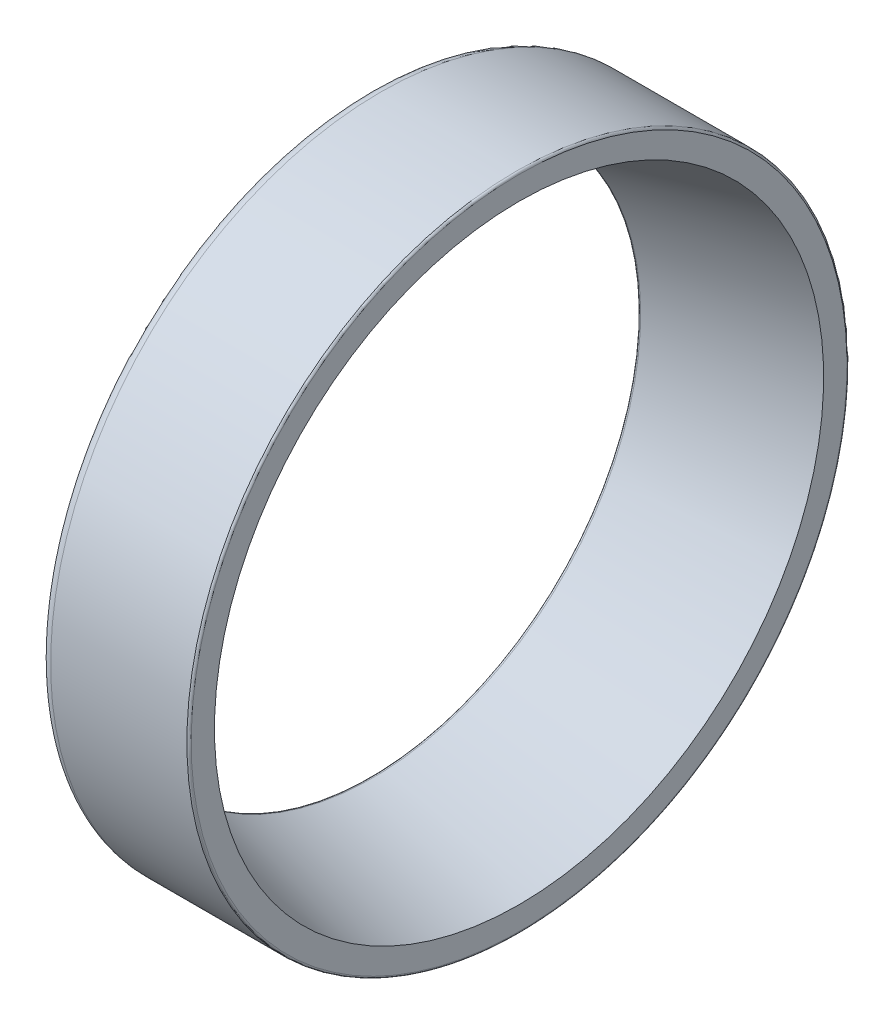
ISO-10303-21;
HEADER;
FILE_DESCRIPTION(('STEP AP214'),'2;1');
FILE_NAME('part.step','',(''),(''),'','','');
FILE_SCHEMA(('AUTOMOTIVE_DESIGN { 1 0 10303 214 1 1 1 1 }'));
ENDSEC;
DATA;
#1=APPLICATION_CONTEXT('core data for automotive mechanical design processes');
#2=APPLICATION_PROTOCOL_DEFINITION('international standard','automotive_design',2000,#1);
#3=PRODUCT_CONTEXT('',#1,'mechanical');
#4=PRODUCT('Part','Part','',(#3));
#5=PRODUCT_RELATED_PRODUCT_CATEGORY('part','',(#4));
#6=PRODUCT_DEFINITION_FORMATION('','',#4);
#7=PRODUCT_DEFINITION_CONTEXT('part definition',#1,'design');
#8=PRODUCT_DEFINITION('design','',#6,#7);
#9=PRODUCT_DEFINITION_SHAPE('','',#8);
#10=(LENGTH_UNIT() NAMED_UNIT(*) SI_UNIT(.MILLI.,.METRE.));
#11=(NAMED_UNIT(*) PLANE_ANGLE_UNIT() SI_UNIT($,.RADIAN.));
#12=(NAMED_UNIT(*) SI_UNIT($,.STERADIAN.) SOLID_ANGLE_UNIT());
#13=UNCERTAINTY_MEASURE_WITH_UNIT(LENGTH_MEASURE(1.E-05),#10,'distance_accuracy_value','');
#14=(GEOMETRIC_REPRESENTATION_CONTEXT(3) GLOBAL_UNCERTAINTY_ASSIGNED_CONTEXT((#13)) GLOBAL_UNIT_ASSIGNED_CONTEXT((#10,
#11,#12)) REPRESENTATION_CONTEXT('',''));
#15=CARTESIAN_POINT('',(0.,0.,0.));
#16=DIRECTION('',(0.,0.,1.));
#17=DIRECTION('',(1.,0.,0.));
#18=AXIS2_PLACEMENT_3D('',#15,#16,#17);
#19=CARTESIAN_POINT('',(0.2,0.,0.));
#20=DIRECTION('',(1.,0.,0.));
#21=DIRECTION('',(0.,0.,-1.));
#22=AXIS2_PLACEMENT_3D('',#19,#20,#21);
#23=TOROIDAL_SURFACE('',#22,25.3674605509307,0.2);
#24=CARTESIAN_POINT('',(0.248506300518238,0.,0.));
#25=DIRECTION('',(1.,0.,0.));
#26=DIRECTION('',(0.,1.,0.));
#27=AXIS2_PLACEMENT_3D('',#24,#25,#26);
#28=CIRCLE('',#27,25.1734318447813);
#29=CARTESIAN_POINT('',(0.248506300518238,25.1734318447813,0.));
#30=VERTEX_POINT('',#29);
#31=EDGE_CURVE('E11',#30,#30,#28,.T.);
#32=ORIENTED_EDGE('',*,*,#31,.T.);
#33=EDGE_LOOP('',(#32));
#34=FACE_BOUND('',#33,.T.);
#35=CARTESIAN_POINT('',(0.,0.,0.));
#36=DIRECTION('',(1.,0.,0.));
#37=DIRECTION('',(0.,1.,0.));
#38=AXIS2_PLACEMENT_3D('',#35,#36,#37);
#39=CIRCLE('',#38,25.3674605509307);
#40=CARTESIAN_POINT('',(0.,25.3674605509307,0.));
#41=VERTEX_POINT('',#40);
#42=EDGE_CURVE('E54',#41,#41,#39,.T.);
#43=ORIENTED_EDGE('',*,*,#42,.F.);
#44=EDGE_LOOP('',(#43));
#45=FACE_BOUND('',#44,.T.);
#46=ADVANCED_FACE('F16',(#34,#45),#23,.T.);
#47=CARTESIAN_POINT('',(7.12425315025912,0.,0.));
#48=DIRECTION('',(1.,0.,0.));
#49=DIRECTION('',(0.,1.,0.));
#50=AXIS2_PLACEMENT_3D('',#47,#48,#49);
#51=CONICAL_SURFACE('',#50,26.8923375139452,0.244974413809924);
#52=CARTESIAN_POINT('',(14.,0.,0.));
#53=DIRECTION('',(1.,0.,0.));
#54=DIRECTION('',(0.,1.,0.));
#55=AXIS2_PLACEMENT_3D('',#52,#53,#54);
#56=CIRCLE('',#55,28.6112431831091);
#57=CARTESIAN_POINT('',(14.,28.6112431831091,0.));
#58=VERTEX_POINT('',#57);
#59=EDGE_CURVE('E23',#58,#58,#56,.T.);
#60=ORIENTED_EDGE('',*,*,#59,.T.);
#61=EDGE_LOOP('',(#60));
#62=FACE_BOUND('',#61,.T.);
#63=ORIENTED_EDGE('',*,*,#31,.F.);
#64=EDGE_LOOP('',(#63));
#65=FACE_BOUND('',#64,.T.);
#66=ADVANCED_FACE('F77',(#62,#65),#51,.F.);
#67=CARTESIAN_POINT('',(14.,29.7056215915546,0.));
#68=DIRECTION('',(1.,0.,0.));
#69=DIRECTION('',(0.,1.,0.));
#70=AXIS2_PLACEMENT_3D('',#67,#68,#69);
#71=PLANE('',#70);
#72=CARTESIAN_POINT('',(14.,0.,0.));
#73=DIRECTION('',(1.,0.,0.));
#74=DIRECTION('',(0.,1.,0.));
#75=AXIS2_PLACEMENT_3D('',#72,#73,#74);
#76=CIRCLE('',#75,30.8);
#77=CARTESIAN_POINT('',(14.,30.8,0.));
#78=VERTEX_POINT('',#77);
#79=EDGE_CURVE('E51',#78,#78,#76,.T.);
#80=ORIENTED_EDGE('',*,*,#79,.T.);
#81=EDGE_LOOP('',(#80));
#82=FACE_BOUND('',#81,.T.);
#83=ORIENTED_EDGE('',*,*,#59,.F.);
#84=EDGE_LOOP('',(#83));
#85=FACE_BOUND('',#84,.T.);
#86=ADVANCED_FACE('F81',(#82,#85),#71,.T.);
#87=CARTESIAN_POINT('',(13.8,0.,0.));
#88=DIRECTION('',(1.,0.,0.));
#89=DIRECTION('',(0.,0.,-1.));
#90=AXIS2_PLACEMENT_3D('',#87,#88,#89);
#91=TOROIDAL_SURFACE('',#90,30.8,0.2);
#92=CARTESIAN_POINT('',(13.8,0.,0.));
#93=DIRECTION('',(1.,0.,0.));
#94=DIRECTION('',(0.,1.,0.));
#95=AXIS2_PLACEMENT_3D('',#92,#93,#94);
#96=CIRCLE('',#95,31.);
#97=CARTESIAN_POINT('',(13.8,31.,0.));
#98=VERTEX_POINT('',#97);
#99=EDGE_CURVE('E47',#98,#98,#96,.T.);
#100=ORIENTED_EDGE('',*,*,#99,.T.);
#101=EDGE_LOOP('',(#100));
#102=FACE_BOUND('',#101,.T.);
#103=ORIENTED_EDGE('',*,*,#79,.F.);
#104=EDGE_LOOP('',(#103));
#105=FACE_BOUND('',#104,.T.);
#106=ADVANCED_FACE('F48',(#102,#105),#91,.T.);
#107=CARTESIAN_POINT('',(7.4,0.,0.));
#108=DIRECTION('',(-1.,0.,0.));
#109=DIRECTION('',(0.,1.,0.));
#110=AXIS2_PLACEMENT_3D('',#107,#108,#109);
#111=CYLINDRICAL_SURFACE('',#110,31.);
#112=CARTESIAN_POINT('',(1.,0.,0.));
#113=DIRECTION('',(1.,0.,0.));
#114=DIRECTION('',(0.,1.,0.));
#115=AXIS2_PLACEMENT_3D('',#112,#113,#114);
#116=CIRCLE('',#115,31.);
#117=CARTESIAN_POINT('',(1.,31.,0.));
#118=VERTEX_POINT('',#117);
#119=EDGE_CURVE('E52',#118,#118,#116,.T.);
#120=ORIENTED_EDGE('',*,*,#119,.T.);
#121=EDGE_LOOP('',(#120));
#122=FACE_BOUND('',#121,.T.);
#123=ORIENTED_EDGE('',*,*,#99,.F.);
#124=EDGE_LOOP('',(#123));
#125=FACE_BOUND('',#124,.T.);
#126=ADVANCED_FACE('F73',(#122,#125),#111,.T.);
#127=CARTESIAN_POINT('',(1.,0.,0.));
#128=DIRECTION('',(1.,0.,0.));
#129=DIRECTION('',(0.,0.,-1.));
#130=AXIS2_PLACEMENT_3D('',#127,#128,#129);
#131=TOROIDAL_SURFACE('',#130,30.,1.);
#132=CARTESIAN_POINT('',(0.,0.,0.));
#133=DIRECTION('',(1.,0.,0.));
#134=DIRECTION('',(0.,1.,0.));
#135=AXIS2_PLACEMENT_3D('',#132,#133,#134);
#136=CIRCLE('',#135,30.);
#137=CARTESIAN_POINT('',(0.,30.,0.));
#138=VERTEX_POINT('',#137);
#139=EDGE_CURVE('E58',#138,#138,#136,.T.);
#140=ORIENTED_EDGE('',*,*,#139,.T.);
#141=EDGE_LOOP('',(#140));
#142=FACE_BOUND('',#141,.T.);
#143=ORIENTED_EDGE('',*,*,#119,.F.);
#144=EDGE_LOOP('',(#143));
#145=FACE_BOUND('',#144,.T.);
#146=ADVANCED_FACE('F62',(#142,#145),#131,.T.);
#147=CARTESIAN_POINT('',(0.,27.6837302754653,0.));
#148=DIRECTION('',(-1.,0.,0.));
#149=DIRECTION('',(0.,-1.,0.));
#150=AXIS2_PLACEMENT_3D('',#147,#148,#149);
#151=PLANE('',#150);
#152=ORIENTED_EDGE('',*,*,#42,.T.);
#153=EDGE_LOOP('',(#152));
#154=FACE_BOUND('',#153,.T.);
#155=ORIENTED_EDGE('',*,*,#139,.F.);
#156=EDGE_LOOP('',(#155));
#157=FACE_BOUND('',#156,.T.);
#158=ADVANCED_FACE('F65',(#154,#157),#151,.T.);
#159=CLOSED_SHELL('',(#46,#66,#86,#106,#126,#146,#158));
#160=MANIFOLD_SOLID_BREP('B1',#159);
#161=ADVANCED_BREP_SHAPE_REPRESENTATION('',(#18,#160),#14);
#162=SHAPE_DEFINITION_REPRESENTATION(#9,#161);
ENDSEC;
END-ISO-10303-21;
